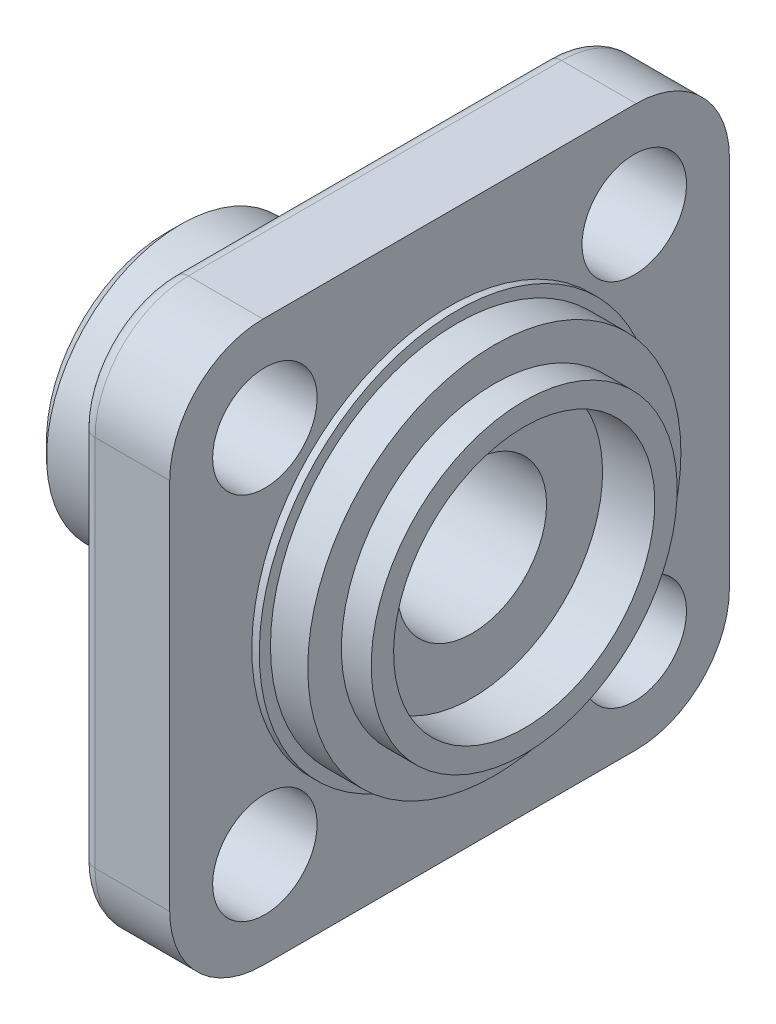
ISO-10303-21;
HEADER;
FILE_DESCRIPTION(('STEP AP214'),'2;1');
FILE_NAME('part.step','',(''),(''),'','','');
FILE_SCHEMA(('AUTOMOTIVE_DESIGN { 1 0 10303 214 1 1 1 1 }'));
ENDSEC;
DATA;
#1=APPLICATION_CONTEXT('core data for automotive mechanical design processes');
#2=APPLICATION_PROTOCOL_DEFINITION('international standard','automotive_design',2000,#1);
#3=PRODUCT_CONTEXT('',#1,'mechanical');
#4=PRODUCT('Part','Part','',(#3));
#5=PRODUCT_RELATED_PRODUCT_CATEGORY('part','',(#4));
#6=PRODUCT_DEFINITION_FORMATION('','',#4);
#7=PRODUCT_DEFINITION_CONTEXT('part definition',#1,'design');
#8=PRODUCT_DEFINITION('design','',#6,#7);
#9=PRODUCT_DEFINITION_SHAPE('','',#8);
#10=(LENGTH_UNIT() NAMED_UNIT(*) SI_UNIT(.MILLI.,.METRE.));
#11=(NAMED_UNIT(*) PLANE_ANGLE_UNIT() SI_UNIT($,.RADIAN.));
#12=(NAMED_UNIT(*) SI_UNIT($,.STERADIAN.) SOLID_ANGLE_UNIT());
#13=UNCERTAINTY_MEASURE_WITH_UNIT(LENGTH_MEASURE(1.E-05),#10,'distance_accuracy_value','');
#14=(GEOMETRIC_REPRESENTATION_CONTEXT(3) GLOBAL_UNCERTAINTY_ASSIGNED_CONTEXT((#13)) GLOBAL_UNIT_ASSIGNED_CONTEXT((#10,
#11,#12)) REPRESENTATION_CONTEXT('',''));
#15=CARTESIAN_POINT('',(0.,0.,0.));
#16=DIRECTION('',(0.,0.,1.));
#17=DIRECTION('',(1.,0.,0.));
#18=AXIS2_PLACEMENT_3D('',#15,#16,#17);
#19=CARTESIAN_POINT('',(53.,0.,0.));
#20=DIRECTION('',(-1.,0.,0.));
#21=DIRECTION('',(0.,-1.,0.));
#22=AXIS2_PLACEMENT_3D('',#19,#20,#21);
#23=CYLINDRICAL_SURFACE('',#22,10.);
#24=CARTESIAN_POINT('',(5.,0.,0.));
#25=DIRECTION('',(-1.,0.,0.));
#26=DIRECTION('',(0.,-1.,0.));
#27=AXIS2_PLACEMENT_3D('',#24,#25,#26);
#28=CIRCLE('',#27,10.);
#29=CARTESIAN_POINT('',(5.,-10.,0.));
#30=VERTEX_POINT('',#29);
#31=EDGE_CURVE('E756',#30,#30,#28,.T.);
#32=ORIENTED_EDGE('',*,*,#31,.T.);
#33=EDGE_LOOP('',(#32));
#34=FACE_BOUND('',#33,.T.);
#35=CARTESIAN_POINT('',(41.,0.,0.));
#36=DIRECTION('',(1.,0.,0.));
#37=DIRECTION('',(0.,1.,0.));
#38=AXIS2_PLACEMENT_3D('',#35,#36,#37);
#39=CIRCLE('',#38,10.);
#40=CARTESIAN_POINT('',(41.,10.,0.));
#41=VERTEX_POINT('',#40);
#42=EDGE_CURVE('E20',#41,#41,#39,.F.);
#43=ORIENTED_EDGE('',*,*,#42,.F.);
#44=EDGE_LOOP('',(#43));
#45=FACE_BOUND('',#44,.T.);
#46=ADVANCED_FACE('F16',(#34,#45),#23,.F.);
#47=CARTESIAN_POINT('',(38.,0.,0.));
#48=DIRECTION('',(1.,0.,0.));
#49=DIRECTION('',(0.,1.,0.));
#50=AXIS2_PLACEMENT_3D('',#47,#48,#49);
#51=CYLINDRICAL_SURFACE('',#50,26.5);
#52=CARTESIAN_POINT('',(38.,0.,0.));
#53=DIRECTION('',(-1.,0.,0.));
#54=DIRECTION('',(0.,-1.,0.));
#55=AXIS2_PLACEMENT_3D('',#52,#53,#54);
#56=CIRCLE('',#55,26.5);
#57=CARTESIAN_POINT('',(38.,-26.5,0.));
#58=VERTEX_POINT('',#57);
#59=EDGE_CURVE('E179',#58,#58,#56,.T.);
#60=ORIENTED_EDGE('',*,*,#59,.F.);
#61=EDGE_LOOP('',(#60));
#62=FACE_BOUND('',#61,.T.);
#63=CARTESIAN_POINT('',(39.,0.,0.));
#64=DIRECTION('',(-1.,0.,0.));
#65=DIRECTION('',(0.,-1.,0.));
#66=AXIS2_PLACEMENT_3D('',#63,#64,#65);
#67=CIRCLE('',#66,26.5);
#68=CARTESIAN_POINT('',(39.,-26.5,0.));
#69=VERTEX_POINT('',#68);
#70=EDGE_CURVE('E123',#69,#69,#67,.T.);
#71=ORIENTED_EDGE('',*,*,#70,.T.);
#72=EDGE_LOOP('',(#71));
#73=FACE_BOUND('',#72,.T.);
#74=ADVANCED_FACE('F300',(#62,#73),#51,.T.);
#75=CARTESIAN_POINT('',(39.,0.,0.));
#76=DIRECTION('',(-1.,0.,0.));
#77=DIRECTION('',(0.,-1.,0.));
#78=AXIS2_PLACEMENT_3D('',#75,#76,#77);
#79=PLANE('',#78);
#80=CARTESIAN_POINT('',(39.,0.,0.));
#81=DIRECTION('',(-1.,0.,0.));
#82=DIRECTION('',(0.,-1.,0.));
#83=AXIS2_PLACEMENT_3D('',#80,#81,#82);
#84=CIRCLE('',#83,25.);
#85=CARTESIAN_POINT('',(39.,-25.,0.));
#86=VERTEX_POINT('',#85);
#87=EDGE_CURVE('E187',#86,#86,#84,.T.);
#88=ORIENTED_EDGE('',*,*,#87,.T.);
#89=EDGE_LOOP('',(#88));
#90=FACE_BOUND('',#89,.T.);
#91=ORIENTED_EDGE('',*,*,#70,.F.);
#92=EDGE_LOOP('',(#91));
#93=FACE_BOUND('',#92,.T.);
#94=ADVANCED_FACE('F306',(#90,#93),#79,.F.);
#95=CARTESIAN_POINT('',(48.,0.,0.));
#96=DIRECTION('',(-1.,0.,0.));
#97=DIRECTION('',(0.,-1.,0.));
#98=AXIS2_PLACEMENT_3D('',#95,#96,#97);
#99=PLANE('',#98);
#100=CARTESIAN_POINT('',(48.,0.,0.));
#101=DIRECTION('',(1.,0.,0.));
#102=DIRECTION('',(0.,1.,0.));
#103=AXIS2_PLACEMENT_3D('',#100,#101,#102);
#104=CIRCLE('',#103,17.5);
#105=CARTESIAN_POINT('',(48.,17.5,0.));
#106=VERTEX_POINT('',#105);
#107=EDGE_CURVE('E759',#106,#106,#104,.T.);
#108=ORIENTED_EDGE('',*,*,#107,.F.);
#109=EDGE_LOOP('',(#108));
#110=FACE_BOUND('',#109,.T.);
#111=CARTESIAN_POINT('',(48.,0.,0.));
#112=DIRECTION('',(1.,0.,0.));
#113=DIRECTION('',(0.,1.,0.));
#114=AXIS2_PLACEMENT_3D('',#111,#112,#113);
#115=CIRCLE('',#114,20.5);
#116=CARTESIAN_POINT('',(48.,20.5,0.));
#117=VERTEX_POINT('',#116);
#118=EDGE_CURVE('E198',#117,#117,#115,.T.);
#119=ORIENTED_EDGE('',*,*,#118,.T.);
#120=EDGE_LOOP('',(#119));
#121=FACE_BOUND('',#120,.T.);
#122=ADVANCED_FACE('F354',(#110,#121),#99,.F.);
#123=CARTESIAN_POINT('',(44.,0.,0.));
#124=DIRECTION('',(1.,0.,0.));
#125=DIRECTION('',(0.,1.,0.));
#126=AXIS2_PLACEMENT_3D('',#123,#124,#125);
#127=CYLINDRICAL_SURFACE('',#126,20.5);
#128=CARTESIAN_POINT('',(44.,0.,0.));
#129=DIRECTION('',(-1.,0.,0.));
#130=DIRECTION('',(0.,-1.,0.));
#131=AXIS2_PLACEMENT_3D('',#128,#129,#130);
#132=CIRCLE('',#131,20.5);
#133=CARTESIAN_POINT('',(44.,-20.5,0.));
#134=VERTEX_POINT('',#133);
#135=EDGE_CURVE('E191',#134,#134,#132,.F.);
#136=ORIENTED_EDGE('',*,*,#135,.T.);
#137=EDGE_LOOP('',(#136));
#138=FACE_BOUND('',#137,.T.);
#139=ORIENTED_EDGE('',*,*,#118,.F.);
#140=EDGE_LOOP('',(#139));
#141=FACE_BOUND('',#140,.T.);
#142=ADVANCED_FACE('F360',(#138,#141),#127,.T.);
#143=CARTESIAN_POINT('',(44.,0.,0.));
#144=DIRECTION('',(-1.,0.,0.));
#145=DIRECTION('',(0.,-1.,0.));
#146=AXIS2_PLACEMENT_3D('',#143,#144,#145);
#147=PLANE('',#146);
#148=ORIENTED_EDGE('',*,*,#135,.F.);
#149=EDGE_LOOP('',(#148));
#150=FACE_BOUND('',#149,.T.);
#151=CARTESIAN_POINT('',(44.,0.,0.));
#152=DIRECTION('',(-1.,0.,0.));
#153=DIRECTION('',(0.,-1.,0.));
#154=AXIS2_PLACEMENT_3D('',#151,#152,#153);
#155=CIRCLE('',#154,25.);
#156=CARTESIAN_POINT('',(44.,-25.,0.));
#157=VERTEX_POINT('',#156);
#158=EDGE_CURVE('E183',#157,#157,#155,.T.);
#159=ORIENTED_EDGE('',*,*,#158,.F.);
#160=EDGE_LOOP('',(#159));
#161=FACE_BOUND('',#160,.T.);
#162=ADVANCED_FACE('F357',(#150,#161),#147,.F.);
#163=CARTESIAN_POINT('',(39.,0.,0.));
#164=DIRECTION('',(1.,0.,0.));
#165=DIRECTION('',(0.,1.,0.));
#166=AXIS2_PLACEMENT_3D('',#163,#164,#165);
#167=CYLINDRICAL_SURFACE('',#166,25.);
#168=ORIENTED_EDGE('',*,*,#87,.F.);
#169=EDGE_LOOP('',(#168));
#170=FACE_BOUND('',#169,.T.);
#171=ORIENTED_EDGE('',*,*,#158,.T.);
#172=EDGE_LOOP('',(#171));
#173=FACE_BOUND('',#172,.T.);
#174=ADVANCED_FACE('F352',(#170,#173),#167,.T.);
#175=CARTESIAN_POINT('',(26.,-25.,25.));
#176=DIRECTION('',(1.,0.,0.));
#177=DIRECTION('',(0.,1.,0.));
#178=AXIS2_PLACEMENT_3D('',#175,#176,#177);
#179=CYLINDRICAL_SURFACE('',#178,12.5);
#180=DIRECTION('',(1.,0.,0.));
#181=VECTOR('',#180,1.);
#182=CARTESIAN_POINT('',(26.,-25.,37.5));
#183=LINE('',#182,#181);
#184=CARTESIAN_POINT('',(28.,-25.,37.5));
#185=VERTEX_POINT('',#184);
#186=CARTESIAN_POINT('',(38.,-25.,37.5));
#187=VERTEX_POINT('',#186);
#188=EDGE_CURVE('E113',#185,#187,#183,.T.);
#189=ORIENTED_EDGE('',*,*,#188,.F.);
#190=CARTESIAN_POINT('',(28.,-25.,25.));
#191=DIRECTION('',(-1.,0.,0.));
#192=DIRECTION('',(0.,-1.,0.));
#193=AXIS2_PLACEMENT_3D('',#190,#191,#192);
#194=CIRCLE('',#193,12.5);
#195=CARTESIAN_POINT('',(28.,-37.5,25.));
#196=VERTEX_POINT('',#195);
#197=EDGE_CURVE('E239',#185,#196,#194,.F.);
#198=ORIENTED_EDGE('',*,*,#197,.T.);
#199=DIRECTION('',(1.,0.,0.));
#200=VECTOR('',#199,1.);
#201=CARTESIAN_POINT('',(26.,-37.5,25.));
#202=LINE('',#201,#200);
#203=CARTESIAN_POINT('',(38.,-37.5,25.));
#204=VERTEX_POINT('',#203);
#205=EDGE_CURVE('E137',#196,#204,#202,.T.);
#206=ORIENTED_EDGE('',*,*,#205,.T.);
#207=CARTESIAN_POINT('',(38.,-25.,25.));
#208=DIRECTION('',(-1.,0.,0.));
#209=DIRECTION('',(0.,-1.,0.));
#210=AXIS2_PLACEMENT_3D('',#207,#208,#209);
#211=CIRCLE('',#210,12.5);
#212=EDGE_CURVE('E130',#204,#187,#211,.T.);
#213=ORIENTED_EDGE('',*,*,#212,.T.);
#214=EDGE_LOOP('',(#189,#198,#206,#213));
#215=FACE_BOUND('',#214,.T.);
#216=ADVANCED_FACE('F135',(#215),#179,.T.);
#217=CARTESIAN_POINT('',(26.,-25.,37.5));
#218=DIRECTION('',(0.,0.,-1.));
#219=DIRECTION('',(-1.,0.,0.));
#220=AXIS2_PLACEMENT_3D('',#217,#218,#219);
#221=PLANE('',#220);
#222=DIRECTION('',(1.,0.,0.));
#223=VECTOR('',#222,1.);
#224=CARTESIAN_POINT('',(26.,25.,37.5));
#225=LINE('',#224,#223);
#226=CARTESIAN_POINT('',(28.,25.,37.5));
#227=VERTEX_POINT('',#226);
#228=CARTESIAN_POINT('',(38.,25.,37.5));
#229=VERTEX_POINT('',#228);
#230=EDGE_CURVE('E124',#227,#229,#225,.T.);
#231=ORIENTED_EDGE('',*,*,#230,.F.);
#232=DIRECTION('',(0.,1.,0.));
#233=VECTOR('',#232,1.);
#234=CARTESIAN_POINT('',(28.,-25.,37.5));
#235=LINE('',#234,#233);
#236=EDGE_CURVE('E120',#227,#185,#235,.F.);
#237=ORIENTED_EDGE('',*,*,#236,.T.);
#238=ORIENTED_EDGE('',*,*,#188,.T.);
#239=DIRECTION('',(0.,1.,0.));
#240=VECTOR('',#239,1.);
#241=CARTESIAN_POINT('',(38.,-25.,37.5));
#242=LINE('',#241,#240);
#243=EDGE_CURVE('E117',#187,#229,#242,.T.);
#244=ORIENTED_EDGE('',*,*,#243,.T.);
#245=EDGE_LOOP('',(#231,#237,#238,#244));
#246=FACE_BOUND('',#245,.T.);
#247=ADVANCED_FACE('F116',(#246),#221,.F.);
#248=CARTESIAN_POINT('',(26.,25.,25.));
#249=DIRECTION('',(1.,0.,0.));
#250=DIRECTION('',(0.,1.,0.));
#251=AXIS2_PLACEMENT_3D('',#248,#249,#250);
#252=CYLINDRICAL_SURFACE('',#251,12.5);
#253=DIRECTION('',(1.,0.,0.));
#254=VECTOR('',#253,1.);
#255=CARTESIAN_POINT('',(26.,37.5,25.));
#256=LINE('',#255,#254);
#257=CARTESIAN_POINT('',(28.,37.5,25.));
#258=VERTEX_POINT('',#257);
#259=CARTESIAN_POINT('',(38.,37.5,25.));
#260=VERTEX_POINT('',#259);
#261=EDGE_CURVE('E175',#258,#260,#256,.T.);
#262=ORIENTED_EDGE('',*,*,#261,.F.);
#263=CARTESIAN_POINT('',(28.,25.,25.));
#264=DIRECTION('',(-1.,0.,0.));
#265=DIRECTION('',(0.,-1.,0.));
#266=AXIS2_PLACEMENT_3D('',#263,#264,#265);
#267=CIRCLE('',#266,12.5);
#268=EDGE_CURVE('E251',#258,#227,#267,.F.);
#269=ORIENTED_EDGE('',*,*,#268,.T.);
#270=ORIENTED_EDGE('',*,*,#230,.T.);
#271=CARTESIAN_POINT('',(38.,25.,25.));
#272=DIRECTION('',(-1.,0.,0.));
#273=DIRECTION('',(0.,1.,0.));
#274=AXIS2_PLACEMENT_3D('',#271,#272,#273);
#275=CIRCLE('',#274,12.5);
#276=EDGE_CURVE('E133',#229,#260,#275,.T.);
#277=ORIENTED_EDGE('',*,*,#276,.T.);
#278=EDGE_LOOP('',(#262,#269,#270,#277));
#279=FACE_BOUND('',#278,.T.);
#280=ADVANCED_FACE('F344',(#279),#252,.T.);
#281=CARTESIAN_POINT('',(26.,37.5,-25.));
#282=DIRECTION('',(0.,-1.,0.));
#283=DIRECTION('',(1.,0.,0.));
#284=AXIS2_PLACEMENT_3D('',#281,#282,#283);
#285=PLANE('',#284);
#286=DIRECTION('',(1.,0.,0.));
#287=VECTOR('',#286,1.);
#288=CARTESIAN_POINT('',(26.,37.5,-25.));
#289=LINE('',#288,#287);
#290=CARTESIAN_POINT('',(28.,37.5,-25.));
#291=VERTEX_POINT('',#290);
#292=CARTESIAN_POINT('',(38.,37.5,-25.));
#293=VERTEX_POINT('',#292);
#294=EDGE_CURVE('E173',#291,#293,#289,.T.);
#295=ORIENTED_EDGE('',*,*,#294,.F.);
#296=DIRECTION('',(0.,0.,-1.));
#297=VECTOR('',#296,1.);
#298=CARTESIAN_POINT('',(28.,37.5,25.));
#299=LINE('',#298,#297);
#300=EDGE_CURVE('E37',#291,#258,#299,.F.);
#301=ORIENTED_EDGE('',*,*,#300,.T.);
#302=ORIENTED_EDGE('',*,*,#261,.T.);
#303=DIRECTION('',(0.,0.,-1.));
#304=VECTOR('',#303,1.);
#305=CARTESIAN_POINT('',(38.,37.5,-25.));
#306=LINE('',#305,#304);
#307=EDGE_CURVE('E150',#260,#293,#306,.T.);
#308=ORIENTED_EDGE('',*,*,#307,.T.);
#309=EDGE_LOOP('',(#295,#301,#302,#308));
#310=FACE_BOUND('',#309,.T.);
#311=ADVANCED_FACE('F341',(#310),#285,.F.);
#312=CARTESIAN_POINT('',(26.,25.,-25.));
#313=DIRECTION('',(1.,0.,0.));
#314=DIRECTION('',(0.,1.,0.));
#315=AXIS2_PLACEMENT_3D('',#312,#313,#314);
#316=CYLINDRICAL_SURFACE('',#315,12.5);
#317=DIRECTION('',(1.,0.,0.));
#318=VECTOR('',#317,1.);
#319=CARTESIAN_POINT('',(26.,25.,-37.5));
#320=LINE('',#319,#318);
#321=CARTESIAN_POINT('',(28.,25.,-37.5));
#322=VERTEX_POINT('',#321);
#323=CARTESIAN_POINT('',(38.,25.,-37.5));
#324=VERTEX_POINT('',#323);
#325=EDGE_CURVE('E171',#322,#324,#320,.T.);
#326=ORIENTED_EDGE('',*,*,#325,.F.);
#327=CARTESIAN_POINT('',(28.,25.,-25.));
#328=DIRECTION('',(-1.,0.,0.));
#329=DIRECTION('',(0.,-1.,0.));
#330=AXIS2_PLACEMENT_3D('',#327,#328,#329);
#331=CIRCLE('',#330,12.5);
#332=EDGE_CURVE('E45',#322,#291,#331,.F.);
#333=ORIENTED_EDGE('',*,*,#332,.T.);
#334=ORIENTED_EDGE('',*,*,#294,.T.);
#335=CARTESIAN_POINT('',(38.,25.,-25.));
#336=DIRECTION('',(-1.,0.,0.));
#337=DIRECTION('',(0.,1.,0.));
#338=AXIS2_PLACEMENT_3D('',#335,#336,#337);
#339=CIRCLE('',#338,12.5);
#340=EDGE_CURVE('E154',#293,#324,#339,.T.);
#341=ORIENTED_EDGE('',*,*,#340,.T.);
#342=EDGE_LOOP('',(#326,#333,#334,#341));
#343=FACE_BOUND('',#342,.T.);
#344=ADVANCED_FACE('F337',(#343),#316,.T.);
#345=CARTESIAN_POINT('',(26.,-25.,-37.5));
#346=DIRECTION('',(0.,0.,1.));
#347=DIRECTION('',(1.,0.,0.));
#348=AXIS2_PLACEMENT_3D('',#345,#346,#347);
#349=PLANE('',#348);
#350=DIRECTION('',(1.,0.,0.));
#351=VECTOR('',#350,1.);
#352=CARTESIAN_POINT('',(26.,-25.,-37.5));
#353=LINE('',#352,#351);
#354=CARTESIAN_POINT('',(28.,-25.,-37.5));
#355=VERTEX_POINT('',#354);
#356=CARTESIAN_POINT('',(38.,-25.,-37.5));
#357=VERTEX_POINT('',#356);
#358=EDGE_CURVE('E169',#355,#357,#353,.T.);
#359=ORIENTED_EDGE('',*,*,#358,.F.);
#360=DIRECTION('',(0.,-1.,0.));
#361=VECTOR('',#360,1.);
#362=CARTESIAN_POINT('',(28.,25.,-37.5));
#363=LINE('',#362,#361);
#364=EDGE_CURVE('E245',#355,#322,#363,.F.);
#365=ORIENTED_EDGE('',*,*,#364,.T.);
#366=ORIENTED_EDGE('',*,*,#325,.T.);
#367=DIRECTION('',(0.,-1.,0.));
#368=VECTOR('',#367,1.);
#369=CARTESIAN_POINT('',(38.,-25.,-37.5));
#370=LINE('',#369,#368);
#371=EDGE_CURVE('E157',#324,#357,#370,.T.);
#372=ORIENTED_EDGE('',*,*,#371,.T.);
#373=EDGE_LOOP('',(#359,#365,#366,#372));
#374=FACE_BOUND('',#373,.T.);
#375=ADVANCED_FACE('F333',(#374),#349,.F.);
#376=CARTESIAN_POINT('',(26.,-25.,-25.));
#377=DIRECTION('',(1.,0.,0.));
#378=DIRECTION('',(0.,1.,0.));
#379=AXIS2_PLACEMENT_3D('',#376,#377,#378);
#380=CYLINDRICAL_SURFACE('',#379,12.5);
#381=DIRECTION('',(1.,0.,0.));
#382=VECTOR('',#381,1.);
#383=CARTESIAN_POINT('',(26.,-37.5,-25.));
#384=LINE('',#383,#382);
#385=CARTESIAN_POINT('',(28.,-37.5,-25.));
#386=VERTEX_POINT('',#385);
#387=CARTESIAN_POINT('',(38.,-37.5,-25.));
#388=VERTEX_POINT('',#387);
#389=EDGE_CURVE('E167',#386,#388,#384,.T.);
#390=ORIENTED_EDGE('',*,*,#389,.F.);
#391=CARTESIAN_POINT('',(28.,-25.,-25.));
#392=DIRECTION('',(-1.,0.,0.));
#393=DIRECTION('',(0.,-1.,0.));
#394=AXIS2_PLACEMENT_3D('',#391,#392,#393);
#395=CIRCLE('',#394,12.5);
#396=EDGE_CURVE('E243',#386,#355,#395,.F.);
#397=ORIENTED_EDGE('',*,*,#396,.T.);
#398=ORIENTED_EDGE('',*,*,#358,.T.);
#399=CARTESIAN_POINT('',(38.,-25.,-25.));
#400=DIRECTION('',(-1.,0.,0.));
#401=DIRECTION('',(0.,1.,0.));
#402=AXIS2_PLACEMENT_3D('',#399,#400,#401);
#403=CIRCLE('',#402,12.5);
#404=EDGE_CURVE('E161',#357,#388,#403,.T.);
#405=ORIENTED_EDGE('',*,*,#404,.T.);
#406=EDGE_LOOP('',(#390,#397,#398,#405));
#407=FACE_BOUND('',#406,.T.);
#408=ADVANCED_FACE('F329',(#407),#380,.T.);
#409=CARTESIAN_POINT('',(26.,-37.5,-25.));
#410=DIRECTION('',(0.,1.,0.));
#411=DIRECTION('',(-1.,0.,0.));
#412=AXIS2_PLACEMENT_3D('',#409,#410,#411);
#413=PLANE('',#412);
#414=ORIENTED_EDGE('',*,*,#205,.F.);
#415=DIRECTION('',(0.,0.,1.));
#416=VECTOR('',#415,1.);
#417=CARTESIAN_POINT('',(28.,-37.5,-25.));
#418=LINE('',#417,#416);
#419=EDGE_CURVE('E241',#196,#386,#418,.F.);
#420=ORIENTED_EDGE('',*,*,#419,.T.);
#421=ORIENTED_EDGE('',*,*,#389,.T.);
#422=DIRECTION('',(0.,0.,1.));
#423=VECTOR('',#422,1.);
#424=CARTESIAN_POINT('',(38.,-37.5,-25.));
#425=LINE('',#424,#423);
#426=EDGE_CURVE('E164',#388,#204,#425,.T.);
#427=ORIENTED_EDGE('',*,*,#426,.T.);
#428=EDGE_LOOP('',(#414,#420,#421,#427));
#429=FACE_BOUND('',#428,.T.);
#430=ADVANCED_FACE('F321',(#429),#413,.F.);
#431=CARTESIAN_POINT('',(26.,-25.,25.));
#432=DIRECTION('',(-1.,0.,0.));
#433=DIRECTION('',(0.,-1.,0.));
#434=AXIS2_PLACEMENT_3D('',#431,#432,#433);
#435=PLANE('',#434);
#436=CARTESIAN_POINT('',(26.,-24.7487373415291,24.7487373415293));
#437=DIRECTION('',(1.,0.,0.));
#438=DIRECTION('',(0.,-1.,0.));
#439=AXIS2_PLACEMENT_3D('',#436,#437,#438);
#440=CIRCLE('',#439,7.);
#441=CARTESIAN_POINT('',(26.,-31.7487373415291,24.7487373415293));
#442=VERTEX_POINT('',#441);
#443=EDGE_CURVE('E790',#442,#442,#440,.T.);
#444=ORIENTED_EDGE('',*,*,#443,.T.);
#445=EDGE_LOOP('',(#444));
#446=FACE_BOUND('',#445,.T.);
#447=CARTESIAN_POINT('',(26.,-24.7487373415291,-24.7487373415293));
#448=DIRECTION('',(1.,0.,0.));
#449=DIRECTION('',(0.,0.,-1.));
#450=AXIS2_PLACEMENT_3D('',#447,#448,#449);
#451=CIRCLE('',#450,7.);
#452=CARTESIAN_POINT('',(26.,-24.748737341529,-31.7487373415293));
#453=VERTEX_POINT('',#452);
#454=EDGE_CURVE('E797',#453,#453,#451,.T.);
#455=ORIENTED_EDGE('',*,*,#454,.T.);
#456=EDGE_LOOP('',(#455));
#457=FACE_BOUND('',#456,.T.);
#458=CARTESIAN_POINT('',(26.,24.7487373415292,24.7487373415292));
#459=DIRECTION('',(1.,0.,0.));
#460=DIRECTION('',(0.,0.,1.));
#461=AXIS2_PLACEMENT_3D('',#458,#459,#460);
#462=CIRCLE('',#461,7.);
#463=CARTESIAN_POINT('',(26.,24.7487373415292,31.7487373415292));
#464=VERTEX_POINT('',#463);
#465=EDGE_CURVE('E784',#464,#464,#462,.T.);
#466=ORIENTED_EDGE('',*,*,#465,.T.);
#467=EDGE_LOOP('',(#466));
#468=FACE_BOUND('',#467,.T.);
#469=CARTESIAN_POINT('',(26.,24.7487373415291,-24.7487373415293));
#470=DIRECTION('',(1.,0.,0.));
#471=DIRECTION('',(0.,1.,0.));
#472=AXIS2_PLACEMENT_3D('',#469,#470,#471);
#473=CIRCLE('',#472,7.);
#474=CARTESIAN_POINT('',(26.,31.7487373415291,-24.7487373415293));
#475=VERTEX_POINT('',#474);
#476=EDGE_CURVE('E763',#475,#475,#473,.T.);
#477=ORIENTED_EDGE('',*,*,#476,.T.);
#478=EDGE_LOOP('',(#477));
#479=FACE_BOUND('',#478,.T.);
#480=CARTESIAN_POINT('',(26.,0.,0.));
#481=DIRECTION('',(-1.,0.,0.));
#482=DIRECTION('',(0.,-1.,0.));
#483=AXIS2_PLACEMENT_3D('',#480,#481,#482);
#484=CIRCLE('',#483,21.);
#485=CARTESIAN_POINT('',(26.,-21.,0.));
#486=VERTEX_POINT('',#485);
#487=EDGE_CURVE('E26',#486,#486,#484,.F.);
#488=ORIENTED_EDGE('',*,*,#487,.T.);
#489=EDGE_LOOP('',(#488));
#490=FACE_BOUND('',#489,.T.);
#491=CARTESIAN_POINT('',(26.,-25.,25.));
#492=DIRECTION('',(-1.,0.,0.));
#493=DIRECTION('',(0.,-1.,0.));
#494=AXIS2_PLACEMENT_3D('',#491,#492,#493);
#495=CIRCLE('',#494,10.5);
#496=CARTESIAN_POINT('',(26.,-35.5,25.));
#497=VERTEX_POINT('',#496);
#498=CARTESIAN_POINT('',(26.,-25.,35.5));
#499=VERTEX_POINT('',#498);
#500=EDGE_CURVE('E231',#497,#499,#495,.T.);
#501=ORIENTED_EDGE('',*,*,#500,.T.);
#502=DIRECTION('',(0.,1.,0.));
#503=VECTOR('',#502,1.);
#504=CARTESIAN_POINT('',(26.,25.,35.5));
#505=LINE('',#504,#503);
#506=CARTESIAN_POINT('',(26.,25.,35.5));
#507=VERTEX_POINT('',#506);
#508=EDGE_CURVE('E233',#499,#507,#505,.T.);
#509=ORIENTED_EDGE('',*,*,#508,.T.);
#510=CARTESIAN_POINT('',(26.,25.,25.));
#511=DIRECTION('',(-1.,0.,0.));
#512=DIRECTION('',(0.,-1.,0.));
#513=AXIS2_PLACEMENT_3D('',#510,#511,#512);
#514=CIRCLE('',#513,10.5);
#515=CARTESIAN_POINT('',(26.,35.5,25.));
#516=VERTEX_POINT('',#515);
#517=EDGE_CURVE('E216',#507,#516,#514,.T.);
#518=ORIENTED_EDGE('',*,*,#517,.T.);
#519=DIRECTION('',(0.,0.,-1.));
#520=VECTOR('',#519,1.);
#521=CARTESIAN_POINT('',(26.,35.5,-25.));
#522=LINE('',#521,#520);
#523=CARTESIAN_POINT('',(26.,35.5,-25.));
#524=VERTEX_POINT('',#523);
#525=EDGE_CURVE('E219',#516,#524,#522,.T.);
#526=ORIENTED_EDGE('',*,*,#525,.T.);
#527=CARTESIAN_POINT('',(26.,25.,-25.));
#528=DIRECTION('',(-1.,0.,0.));
#529=DIRECTION('',(0.,-1.,0.));
#530=AXIS2_PLACEMENT_3D('',#527,#528,#529);
#531=CIRCLE('',#530,10.5);
#532=CARTESIAN_POINT('',(26.,25.,-35.5));
#533=VERTEX_POINT('',#532);
#534=EDGE_CURVE('E222',#524,#533,#531,.T.);
#535=ORIENTED_EDGE('',*,*,#534,.T.);
#536=DIRECTION('',(0.,-1.,0.));
#537=VECTOR('',#536,1.);
#538=CARTESIAN_POINT('',(26.,-25.,-35.5));
#539=LINE('',#538,#537);
#540=CARTESIAN_POINT('',(26.,-25.,-35.5));
#541=VERTEX_POINT('',#540);
#542=EDGE_CURVE('E224',#533,#541,#539,.T.);
#543=ORIENTED_EDGE('',*,*,#542,.T.);
#544=CARTESIAN_POINT('',(26.,-25.,-25.));
#545=DIRECTION('',(-1.,0.,0.));
#546=DIRECTION('',(0.,-1.,0.));
#547=AXIS2_PLACEMENT_3D('',#544,#545,#546);
#548=CIRCLE('',#547,10.5);
#549=CARTESIAN_POINT('',(26.,-35.5,-25.));
#550=VERTEX_POINT('',#549);
#551=EDGE_CURVE('E227',#541,#550,#548,.T.);
#552=ORIENTED_EDGE('',*,*,#551,.T.);
#553=DIRECTION('',(0.,0.,1.));
#554=VECTOR('',#553,1.);
#555=CARTESIAN_POINT('',(26.,-35.5,25.));
#556=LINE('',#555,#554);
#557=EDGE_CURVE('E229',#550,#497,#556,.T.);
#558=ORIENTED_EDGE('',*,*,#557,.T.);
#559=EDGE_LOOP('',(#501,#509,#518,#526,#535,#543,#552,#558));
#560=FACE_BOUND('',#559,.T.);
#561=ADVANCED_FACE('F280',(#446,#457,#468,#479,#490,#560),#435,.T.);
#562=CARTESIAN_POINT('',(38.,-25.,25.));
#563=DIRECTION('',(-1.,0.,0.));
#564=DIRECTION('',(0.,-1.,0.));
#565=AXIS2_PLACEMENT_3D('',#562,#563,#564);
#566=PLANE('',#565);
#567=CARTESIAN_POINT('',(38.,-24.7487373415291,24.7487373415293));
#568=DIRECTION('',(1.,0.,0.));
#569=DIRECTION('',(0.,-1.,0.));
#570=AXIS2_PLACEMENT_3D('',#567,#568,#569);
#571=CIRCLE('',#570,7.);
#572=CARTESIAN_POINT('',(38.,-31.7487373415291,24.7487373415293));
#573=VERTEX_POINT('',#572);
#574=EDGE_CURVE('E800',#573,#573,#571,.T.);
#575=ORIENTED_EDGE('',*,*,#574,.F.);
#576=EDGE_LOOP('',(#575));
#577=FACE_BOUND('',#576,.T.);
#578=CARTESIAN_POINT('',(38.,-24.7487373415291,-24.7487373415293));
#579=DIRECTION('',(1.,0.,0.));
#580=DIRECTION('',(0.,0.,-1.));
#581=AXIS2_PLACEMENT_3D('',#578,#579,#580);
#582=CIRCLE('',#581,7.);
#583=CARTESIAN_POINT('',(38.,-24.748737341529,-31.7487373415293));
#584=VERTEX_POINT('',#583);
#585=EDGE_CURVE('E794',#584,#584,#582,.T.);
#586=ORIENTED_EDGE('',*,*,#585,.F.);
#587=EDGE_LOOP('',(#586));
#588=FACE_BOUND('',#587,.T.);
#589=CARTESIAN_POINT('',(38.,24.7487373415292,24.7487373415292));
#590=DIRECTION('',(1.,0.,0.));
#591=DIRECTION('',(0.,0.,1.));
#592=AXIS2_PLACEMENT_3D('',#589,#590,#591);
#593=CIRCLE('',#592,7.);
#594=CARTESIAN_POINT('',(38.,24.7487373415292,31.7487373415292));
#595=VERTEX_POINT('',#594);
#596=EDGE_CURVE('E787',#595,#595,#593,.T.);
#597=ORIENTED_EDGE('',*,*,#596,.F.);
#598=EDGE_LOOP('',(#597));
#599=FACE_BOUND('',#598,.T.);
#600=CARTESIAN_POINT('',(38.,24.7487373415291,-24.7487373415293));
#601=DIRECTION('',(1.,0.,0.));
#602=DIRECTION('',(0.,1.,0.));
#603=AXIS2_PLACEMENT_3D('',#600,#601,#602);
#604=CIRCLE('',#603,7.);
#605=CARTESIAN_POINT('',(38.,31.7487373415291,-24.7487373415293));
#606=VERTEX_POINT('',#605);
#607=EDGE_CURVE('E766',#606,#606,#604,.T.);
#608=ORIENTED_EDGE('',*,*,#607,.F.);
#609=EDGE_LOOP('',(#608));
#610=FACE_BOUND('',#609,.T.);
#611=ORIENTED_EDGE('',*,*,#59,.T.);
#612=EDGE_LOOP('',(#611));
#613=FACE_BOUND('',#612,.T.);
#614=ORIENTED_EDGE('',*,*,#212,.F.);
#615=ORIENTED_EDGE('',*,*,#426,.F.);
#616=ORIENTED_EDGE('',*,*,#404,.F.);
#617=ORIENTED_EDGE('',*,*,#371,.F.);
#618=ORIENTED_EDGE('',*,*,#340,.F.);
#619=ORIENTED_EDGE('',*,*,#307,.F.);
#620=ORIENTED_EDGE('',*,*,#276,.F.);
#621=ORIENTED_EDGE('',*,*,#243,.F.);
#622=EDGE_LOOP('',(#614,#615,#616,#617,#618,#619,#620,#621));
#623=FACE_BOUND('',#622,.T.);
#624=ADVANCED_FACE('F128',(#577,#588,#599,#610,#613,#623),#566,.F.);
#625=CARTESIAN_POINT('',(0.,0.,0.));
#626=DIRECTION('',(-1.,0.,0.));
#627=DIRECTION('',(0.,-1.,0.));
#628=AXIS2_PLACEMENT_3D('',#625,#626,#627);
#629=PLANE('',#628);
#630=CARTESIAN_POINT('',(0.,0.,0.));
#631=DIRECTION('',(-1.,0.,0.));
#632=DIRECTION('',(0.,-1.,0.));
#633=AXIS2_PLACEMENT_3D('',#630,#631,#632);
#634=CIRCLE('',#633,14.25);
#635=CARTESIAN_POINT('',(0.,-14.25,0.));
#636=VERTEX_POINT('',#635);
#637=EDGE_CURVE('E145',#636,#636,#634,.T.);
#638=ORIENTED_EDGE('',*,*,#637,.F.);
#639=EDGE_LOOP('',(#638));
#640=FACE_BOUND('',#639,.T.);
#641=CARTESIAN_POINT('',(0.,0.,0.));
#642=DIRECTION('',(1.,0.,0.));
#643=DIRECTION('',(0.,1.,0.));
#644=AXIS2_PLACEMENT_3D('',#641,#642,#643);
#645=CIRCLE('',#644,16.);
#646=CARTESIAN_POINT('',(0.,16.,0.));
#647=VERTEX_POINT('',#646);
#648=EDGE_CURVE('E213',#647,#647,#645,.T.);
#649=ORIENTED_EDGE('',*,*,#648,.F.);
#650=EDGE_LOOP('',(#649));
#651=FACE_BOUND('',#650,.T.);
#652=ADVANCED_FACE('F325',(#640,#651),#629,.T.);
#653=CARTESIAN_POINT('',(2.,0.,0.));
#654=DIRECTION('',(1.,0.,0.));
#655=DIRECTION('',(0.,1.,0.));
#656=AXIS2_PLACEMENT_3D('',#653,#654,#655);
#657=CONICAL_SURFACE('',#656,18.,0.785398163397445);
#658=ORIENTED_EDGE('',*,*,#648,.T.);
#659=EDGE_LOOP('',(#658));
#660=FACE_BOUND('',#659,.T.);
#661=CARTESIAN_POINT('',(2.,0.,0.));
#662=DIRECTION('',(1.,0.,0.));
#663=DIRECTION('',(0.,1.,0.));
#664=AXIS2_PLACEMENT_3D('',#661,#662,#663);
#665=CIRCLE('',#664,18.);
#666=CARTESIAN_POINT('',(2.,18.,0.));
#667=VERTEX_POINT('',#666);
#668=EDGE_CURVE('E210',#667,#667,#665,.T.);
#669=ORIENTED_EDGE('',*,*,#668,.F.);
#670=EDGE_LOOP('',(#669));
#671=FACE_BOUND('',#670,.T.);
#672=ADVANCED_FACE('F383',(#660,#671),#657,.T.);
#673=CARTESIAN_POINT('',(17.,0.,0.));
#674=DIRECTION('',(1.,0.,0.));
#675=DIRECTION('',(0.,1.,0.));
#676=AXIS2_PLACEMENT_3D('',#673,#674,#675);
#677=CYLINDRICAL_SURFACE('',#676,18.);
#678=ORIENTED_EDGE('',*,*,#668,.T.);
#679=EDGE_LOOP('',(#678));
#680=FACE_BOUND('',#679,.T.);
#681=CARTESIAN_POINT('',(15.,0.,0.));
#682=DIRECTION('',(1.,0.,0.));
#683=DIRECTION('',(0.,1.,0.));
#684=AXIS2_PLACEMENT_3D('',#681,#682,#683);
#685=CIRCLE('',#684,18.);
#686=CARTESIAN_POINT('',(15.,18.,0.));
#687=VERTEX_POINT('',#686);
#688=EDGE_CURVE('E206',#687,#687,#685,.T.);
#689=ORIENTED_EDGE('',*,*,#688,.F.);
#690=EDGE_LOOP('',(#689));
#691=FACE_BOUND('',#690,.T.);
#692=ADVANCED_FACE('F379',(#680,#691),#677,.T.);
#693=CARTESIAN_POINT('',(17.,0.,0.));
#694=DIRECTION('',(-1.,0.,0.));
#695=DIRECTION('',(0.,-1.,0.));
#696=AXIS2_PLACEMENT_3D('',#693,#694,#695);
#697=CONICAL_SURFACE('',#696,16.,0.78539816339745);
#698=ORIENTED_EDGE('',*,*,#688,.T.);
#699=EDGE_LOOP('',(#698));
#700=FACE_BOUND('',#699,.T.);
#701=CARTESIAN_POINT('',(17.,0.,0.));
#702=DIRECTION('',(1.,0.,0.));
#703=DIRECTION('',(0.,1.,0.));
#704=AXIS2_PLACEMENT_3D('',#701,#702,#703);
#705=CIRCLE('',#704,16.);
#706=CARTESIAN_POINT('',(17.,16.,0.));
#707=VERTEX_POINT('',#706);
#708=EDGE_CURVE('E202',#707,#707,#705,.T.);
#709=ORIENTED_EDGE('',*,*,#708,.F.);
#710=EDGE_LOOP('',(#709));
#711=FACE_BOUND('',#710,.T.);
#712=ADVANCED_FACE('F375',(#700,#711),#697,.T.);
#713=CARTESIAN_POINT('',(48.,0.,0.));
#714=DIRECTION('',(-1.,0.,0.));
#715=DIRECTION('',(0.,-1.,0.));
#716=AXIS2_PLACEMENT_3D('',#713,#714,#715);
#717=CYLINDRICAL_SURFACE('',#716,16.);
#718=CARTESIAN_POINT('',(21.,0.,0.));
#719=DIRECTION('',(-1.,0.,0.));
#720=DIRECTION('',(0.,-1.,0.));
#721=AXIS2_PLACEMENT_3D('',#718,#719,#720);
#722=CIRCLE('',#721,16.);
#723=CARTESIAN_POINT('',(21.,-16.,0.));
#724=VERTEX_POINT('',#723);
#725=EDGE_CURVE('E11',#724,#724,#722,.T.);
#726=ORIENTED_EDGE('',*,*,#725,.T.);
#727=EDGE_LOOP('',(#726));
#728=FACE_BOUND('',#727,.T.);
#729=ORIENTED_EDGE('',*,*,#708,.T.);
#730=EDGE_LOOP('',(#729));
#731=FACE_BOUND('',#730,.T.);
#732=ADVANCED_FACE('F371',(#728,#731),#717,.T.);
#733=CARTESIAN_POINT('',(28.,-25.,-35.5));
#734=DIRECTION('',(0.,1.,0.));
#735=DIRECTION('',(-1.,0.,0.));
#736=AXIS2_PLACEMENT_3D('',#733,#734,#735);
#737=CYLINDRICAL_SURFACE('',#736,2.);
#738=CARTESIAN_POINT('',(28.,25.,-35.5));
#739=DIRECTION('',(0.,1.,0.));
#740=DIRECTION('',(0.,0.,1.));
#741=AXIS2_PLACEMENT_3D('',#738,#739,#740);
#742=CIRCLE('',#741,2.);
#743=EDGE_CURVE('E142',#322,#533,#742,.T.);
#744=ORIENTED_EDGE('',*,*,#743,.F.);
#745=ORIENTED_EDGE('',*,*,#364,.F.);
#746=CARTESIAN_POINT('',(28.,-25.,-35.5));
#747=DIRECTION('',(0.,-1.,0.));
#748=DIRECTION('',(0.,0.,-1.));
#749=AXIS2_PLACEMENT_3D('',#746,#747,#748);
#750=CIRCLE('',#749,2.);
#751=EDGE_CURVE('E139',#541,#355,#750,.T.);
#752=ORIENTED_EDGE('',*,*,#751,.F.);
#753=ORIENTED_EDGE('',*,*,#542,.F.);
#754=EDGE_LOOP('',(#744,#745,#752,#753));
#755=FACE_BOUND('',#754,.T.);
#756=ADVANCED_FACE('F374',(#755),#737,.T.);
#757=CARTESIAN_POINT('',(28.,-25.,-25.));
#758=DIRECTION('',(-1.,0.,0.));
#759=DIRECTION('',(0.,-1.,0.));
#760=AXIS2_PLACEMENT_3D('',#757,#758,#759);
#761=TOROIDAL_SURFACE('',#760,10.5,2.);
#762=ORIENTED_EDGE('',*,*,#751,.T.);
#763=ORIENTED_EDGE('',*,*,#396,.F.);
#764=CARTESIAN_POINT('',(28.,-35.5,-25.));
#765=DIRECTION('',(0.,0.,1.));
#766=DIRECTION('',(1.,0.,0.));
#767=AXIS2_PLACEMENT_3D('',#764,#765,#766);
#768=CIRCLE('',#767,2.);
#769=EDGE_CURVE('E269',#550,#386,#768,.T.);
#770=ORIENTED_EDGE('',*,*,#769,.F.);
#771=ORIENTED_EDGE('',*,*,#551,.F.);
#772=EDGE_LOOP('',(#762,#763,#770,#771));
#773=FACE_BOUND('',#772,.T.);
#774=ADVANCED_FACE('F409',(#773),#761,.T.);
#775=CARTESIAN_POINT('',(28.,25.,-25.));
#776=DIRECTION('',(-1.,0.,0.));
#777=DIRECTION('',(0.,-1.,0.));
#778=AXIS2_PLACEMENT_3D('',#775,#776,#777);
#779=TOROIDAL_SURFACE('',#778,10.5,2.);
#780=ORIENTED_EDGE('',*,*,#743,.T.);
#781=ORIENTED_EDGE('',*,*,#534,.F.);
#782=CARTESIAN_POINT('',(28.,35.5,-25.));
#783=DIRECTION('',(0.,0.,1.));
#784=DIRECTION('',(1.,0.,0.));
#785=AXIS2_PLACEMENT_3D('',#782,#783,#784);
#786=CIRCLE('',#785,2.);
#787=EDGE_CURVE('E266',#291,#524,#786,.T.);
#788=ORIENTED_EDGE('',*,*,#787,.F.);
#789=ORIENTED_EDGE('',*,*,#332,.F.);
#790=EDGE_LOOP('',(#780,#781,#788,#789));
#791=FACE_BOUND('',#790,.T.);
#792=ADVANCED_FACE('F405',(#791),#779,.T.);
#793=CARTESIAN_POINT('',(28.,-35.5,25.));
#794=DIRECTION('',(0.,0.,-1.));
#795=DIRECTION('',(-1.,0.,0.));
#796=AXIS2_PLACEMENT_3D('',#793,#794,#795);
#797=CYLINDRICAL_SURFACE('',#796,2.);
#798=ORIENTED_EDGE('',*,*,#769,.T.);
#799=ORIENTED_EDGE('',*,*,#419,.F.);
#800=CARTESIAN_POINT('',(28.,-35.5,25.));
#801=DIRECTION('',(0.,0.,1.));
#802=DIRECTION('',(0.,-1.,0.));
#803=AXIS2_PLACEMENT_3D('',#800,#801,#802);
#804=CIRCLE('',#803,2.);
#805=EDGE_CURVE('E263',#497,#196,#804,.T.);
#806=ORIENTED_EDGE('',*,*,#805,.F.);
#807=ORIENTED_EDGE('',*,*,#557,.F.);
#808=EDGE_LOOP('',(#798,#799,#806,#807));
#809=FACE_BOUND('',#808,.T.);
#810=ADVANCED_FACE('F401',(#809),#797,.T.);
#811=CARTESIAN_POINT('',(28.,35.5,25.));
#812=DIRECTION('',(0.,0.,1.));
#813=DIRECTION('',(1.,0.,0.));
#814=AXIS2_PLACEMENT_3D('',#811,#812,#813);
#815=CYLINDRICAL_SURFACE('',#814,2.);
#816=ORIENTED_EDGE('',*,*,#787,.T.);
#817=ORIENTED_EDGE('',*,*,#525,.F.);
#818=CARTESIAN_POINT('',(28.,35.5,25.));
#819=DIRECTION('',(0.,0.,1.));
#820=DIRECTION('',(1.,0.,0.));
#821=AXIS2_PLACEMENT_3D('',#818,#819,#820);
#822=CIRCLE('',#821,2.);
#823=EDGE_CURVE('E259',#258,#516,#822,.T.);
#824=ORIENTED_EDGE('',*,*,#823,.F.);
#825=ORIENTED_EDGE('',*,*,#300,.F.);
#826=EDGE_LOOP('',(#816,#817,#824,#825));
#827=FACE_BOUND('',#826,.T.);
#828=ADVANCED_FACE('F397',(#827),#815,.T.);
#829=CARTESIAN_POINT('',(28.,-25.,25.));
#830=DIRECTION('',(-1.,0.,0.));
#831=DIRECTION('',(0.,-1.,0.));
#832=AXIS2_PLACEMENT_3D('',#829,#830,#831);
#833=TOROIDAL_SURFACE('',#832,10.5,2.);
#834=ORIENTED_EDGE('',*,*,#805,.T.);
#835=ORIENTED_EDGE('',*,*,#197,.F.);
#836=CARTESIAN_POINT('',(28.,-25.,35.5));
#837=DIRECTION('',(0.,1.,0.));
#838=DIRECTION('',(0.,0.,1.));
#839=AXIS2_PLACEMENT_3D('',#836,#837,#838);
#840=CIRCLE('',#839,2.);
#841=EDGE_CURVE('E256',#499,#185,#840,.T.);
#842=ORIENTED_EDGE('',*,*,#841,.F.);
#843=ORIENTED_EDGE('',*,*,#500,.F.);
#844=EDGE_LOOP('',(#834,#835,#842,#843));
#845=FACE_BOUND('',#844,.T.);
#846=ADVANCED_FACE('F393',(#845),#833,.T.);
#847=CARTESIAN_POINT('',(28.,25.,25.));
#848=DIRECTION('',(-1.,0.,0.));
#849=DIRECTION('',(0.,-1.,0.));
#850=AXIS2_PLACEMENT_3D('',#847,#848,#849);
#851=TOROIDAL_SURFACE('',#850,10.5,2.);
#852=ORIENTED_EDGE('',*,*,#823,.T.);
#853=ORIENTED_EDGE('',*,*,#517,.F.);
#854=CARTESIAN_POINT('',(28.,25.,35.5));
#855=DIRECTION('',(0.,-1.,0.));
#856=DIRECTION('',(1.,0.,0.));
#857=AXIS2_PLACEMENT_3D('',#854,#855,#856);
#858=CIRCLE('',#857,2.);
#859=EDGE_CURVE('E254',#227,#507,#858,.T.);
#860=ORIENTED_EDGE('',*,*,#859,.F.);
#861=ORIENTED_EDGE('',*,*,#268,.F.);
#862=EDGE_LOOP('',(#852,#853,#860,#861));
#863=FACE_BOUND('',#862,.T.);
#864=ADVANCED_FACE('F295',(#863),#851,.T.);
#865=CARTESIAN_POINT('',(28.,-25.,35.5));
#866=DIRECTION('',(0.,-1.,0.));
#867=DIRECTION('',(1.,0.,0.));
#868=AXIS2_PLACEMENT_3D('',#865,#866,#867);
#869=CYLINDRICAL_SURFACE('',#868,2.);
#870=ORIENTED_EDGE('',*,*,#841,.T.);
#871=ORIENTED_EDGE('',*,*,#236,.F.);
#872=ORIENTED_EDGE('',*,*,#859,.T.);
#873=ORIENTED_EDGE('',*,*,#508,.F.);
#874=EDGE_LOOP('',(#870,#871,#872,#873));
#875=FACE_BOUND('',#874,.T.);
#876=ADVANCED_FACE('F285',(#875),#869,.T.);
#877=CARTESIAN_POINT('',(21.,0.,0.));
#878=DIRECTION('',(-1.,0.,0.));
#879=DIRECTION('',(0.,-1.,0.));
#880=AXIS2_PLACEMENT_3D('',#877,#878,#879);
#881=TOROIDAL_SURFACE('',#880,21.,5.);
#882=ORIENTED_EDGE('',*,*,#725,.F.);
#883=EDGE_LOOP('',(#882));
#884=FACE_BOUND('',#883,.T.);
#885=ORIENTED_EDGE('',*,*,#487,.F.);
#886=EDGE_LOOP('',(#885));
#887=FACE_BOUND('',#886,.T.);
#888=ADVANCED_FACE('F18',(#884,#887),#881,.F.);
#889=CARTESIAN_POINT('',(5.,0.,0.));
#890=DIRECTION('',(-1.,0.,0.));
#891=DIRECTION('',(0.,-1.,0.));
#892=AXIS2_PLACEMENT_3D('',#889,#890,#891);
#893=CYLINDRICAL_SURFACE('',#892,14.25);
#894=CARTESIAN_POINT('',(5.,0.,0.));
#895=DIRECTION('',(-1.,0.,0.));
#896=DIRECTION('',(0.,-1.,0.));
#897=AXIS2_PLACEMENT_3D('',#894,#895,#896);
#898=CIRCLE('',#897,14.25);
#899=CARTESIAN_POINT('',(5.,-14.25,0.));
#900=VERTEX_POINT('',#899);
#901=EDGE_CURVE('E257',#900,#900,#898,.T.);
#902=ORIENTED_EDGE('',*,*,#901,.F.);
#903=EDGE_LOOP('',(#902));
#904=FACE_BOUND('',#903,.T.);
#905=ORIENTED_EDGE('',*,*,#637,.T.);
#906=EDGE_LOOP('',(#905));
#907=FACE_BOUND('',#906,.T.);
#908=ADVANCED_FACE('F284',(#904,#907),#893,.F.);
#909=CARTESIAN_POINT('',(5.,0.,0.));
#910=DIRECTION('',(-1.,0.,0.));
#911=DIRECTION('',(0.,-1.,0.));
#912=AXIS2_PLACEMENT_3D('',#909,#910,#911);
#913=PLANE('',#912);
#914=ORIENTED_EDGE('',*,*,#31,.F.);
#915=EDGE_LOOP('',(#914));
#916=FACE_BOUND('',#915,.T.);
#917=ORIENTED_EDGE('',*,*,#901,.T.);
#918=EDGE_LOOP('',(#917));
#919=FACE_BOUND('',#918,.T.);
#920=ADVANCED_FACE('F292',(#916,#919),#913,.T.);
#921=CARTESIAN_POINT('',(41.,0.,0.));
#922=DIRECTION('',(1.,0.,0.));
#923=DIRECTION('',(0.,1.,0.));
#924=AXIS2_PLACEMENT_3D('',#921,#922,#923);
#925=PLANE('',#924);
#926=CARTESIAN_POINT('',(41.,0.,0.));
#927=DIRECTION('',(1.,0.,0.));
#928=DIRECTION('',(0.,1.,0.));
#929=AXIS2_PLACEMENT_3D('',#926,#927,#928);
#930=CIRCLE('',#929,17.5);
#931=CARTESIAN_POINT('',(41.,17.5,0.));
#932=VERTEX_POINT('',#931);
#933=EDGE_CURVE('E753',#932,#932,#930,.T.);
#934=ORIENTED_EDGE('',*,*,#933,.T.);
#935=EDGE_LOOP('',(#934));
#936=FACE_BOUND('',#935,.T.);
#937=ORIENTED_EDGE('',*,*,#42,.T.);
#938=EDGE_LOOP('',(#937));
#939=FACE_BOUND('',#938,.T.);
#940=ADVANCED_FACE('F316',(#936,#939),#925,.T.);
#941=CARTESIAN_POINT('',(41.,0.,0.));
#942=DIRECTION('',(1.,0.,0.));
#943=DIRECTION('',(0.,1.,0.));
#944=AXIS2_PLACEMENT_3D('',#941,#942,#943);
#945=CYLINDRICAL_SURFACE('',#944,17.5);
#946=ORIENTED_EDGE('',*,*,#933,.F.);
#947=EDGE_LOOP('',(#946));
#948=FACE_BOUND('',#947,.T.);
#949=ORIENTED_EDGE('',*,*,#107,.T.);
#950=EDGE_LOOP('',(#949));
#951=FACE_BOUND('',#950,.T.);
#952=ADVANCED_FACE('F313',(#948,#951),#945,.F.);
#953=CARTESIAN_POINT('',(26.,24.7487373415291,-24.7487373415293));
#954=DIRECTION('',(1.,0.,0.));
#955=DIRECTION('',(0.,1.,0.));
#956=AXIS2_PLACEMENT_3D('',#953,#954,#955);
#957=CYLINDRICAL_SURFACE('',#956,7.);
#958=ORIENTED_EDGE('',*,*,#476,.F.);
#959=EDGE_LOOP('',(#958));
#960=FACE_BOUND('',#959,.T.);
#961=ORIENTED_EDGE('',*,*,#607,.T.);
#962=EDGE_LOOP('',(#961));
#963=FACE_BOUND('',#962,.T.);
#964=ADVANCED_FACE('F497',(#960,#963),#957,.F.);
#965=CARTESIAN_POINT('',(26.,24.7487373415292,24.7487373415292));
#966=DIRECTION('',(1.,0.,0.));
#967=DIRECTION('',(0.,1.,0.));
#968=AXIS2_PLACEMENT_3D('',#965,#966,#967);
#969=CYLINDRICAL_SURFACE('',#968,7.);
#970=ORIENTED_EDGE('',*,*,#465,.F.);
#971=EDGE_LOOP('',(#970));
#972=FACE_BOUND('',#971,.T.);
#973=ORIENTED_EDGE('',*,*,#596,.T.);
#974=EDGE_LOOP('',(#973));
#975=FACE_BOUND('',#974,.T.);
#976=ADVANCED_FACE('F514',(#972,#975),#969,.F.);
#977=CARTESIAN_POINT('',(26.,-24.7487373415291,-24.7487373415293));
#978=DIRECTION('',(1.,0.,0.));
#979=DIRECTION('',(0.,1.,0.));
#980=AXIS2_PLACEMENT_3D('',#977,#978,#979);
#981=CYLINDRICAL_SURFACE('',#980,7.);
#982=ORIENTED_EDGE('',*,*,#454,.F.);
#983=EDGE_LOOP('',(#982));
#984=FACE_BOUND('',#983,.T.);
#985=ORIENTED_EDGE('',*,*,#585,.T.);
#986=EDGE_LOOP('',(#985));
#987=FACE_BOUND('',#986,.T.);
#988=ADVANCED_FACE('F517',(#984,#987),#981,.F.);
#989=CARTESIAN_POINT('',(26.,-24.7487373415291,24.7487373415293));
#990=DIRECTION('',(1.,0.,0.));
#991=DIRECTION('',(0.,1.,0.));
#992=AXIS2_PLACEMENT_3D('',#989,#990,#991);
#993=CYLINDRICAL_SURFACE('',#992,7.);
#994=ORIENTED_EDGE('',*,*,#443,.F.);
#995=EDGE_LOOP('',(#994));
#996=FACE_BOUND('',#995,.T.);
#997=ORIENTED_EDGE('',*,*,#574,.T.);
#998=EDGE_LOOP('',(#997));
#999=FACE_BOUND('',#998,.T.);
#1000=ADVANCED_FACE('F529',(#996,#999),#993,.F.);
#1001=CLOSED_SHELL('',(#46,#74,#94,#122,#142,#162,#174,#216,#247,#280,#311,#344,#375,#408,#430,
#561,#624,#652,#672,#692,#712,#732,#756,#774,#792,#810,#828,#846,#864,#876,#888,#908,#920,#940,
#952,#964,#976,#988,#1000));
#1002=MANIFOLD_SOLID_BREP('B1',#1001);
#1003=ADVANCED_BREP_SHAPE_REPRESENTATION('',(#18,#1002),#14);
#1004=SHAPE_DEFINITION_REPRESENTATION(#9,#1003);
ENDSEC;
END-ISO-10303-21;
